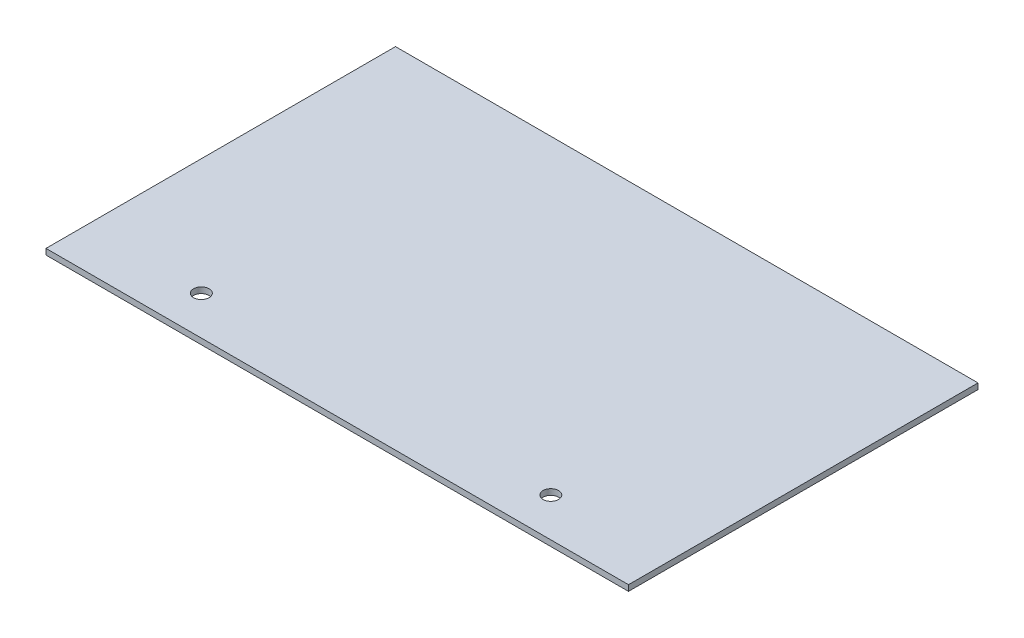
ISO-10303-21;
HEADER;
FILE_DESCRIPTION(('STEP AP214'),'2;1');
FILE_NAME('part.step','',(''),(''),'','','');
FILE_SCHEMA(('AUTOMOTIVE_DESIGN { 1 0 10303 214 1 1 1 1 }'));
ENDSEC;
DATA;
#1=APPLICATION_CONTEXT('core data for automotive mechanical design processes');
#2=APPLICATION_PROTOCOL_DEFINITION('international standard','automotive_design',2000,#1);
#3=PRODUCT_CONTEXT('',#1,'mechanical');
#4=PRODUCT('Part','Part','',(#3));
#5=PRODUCT_RELATED_PRODUCT_CATEGORY('part','',(#4));
#6=PRODUCT_DEFINITION_FORMATION('','',#4);
#7=PRODUCT_DEFINITION_CONTEXT('part definition',#1,'design');
#8=PRODUCT_DEFINITION('design','',#6,#7);
#9=PRODUCT_DEFINITION_SHAPE('','',#8);
#10=(LENGTH_UNIT() NAMED_UNIT(*) SI_UNIT(.MILLI.,.METRE.));
#11=(NAMED_UNIT(*) PLANE_ANGLE_UNIT() SI_UNIT($,.RADIAN.));
#12=(NAMED_UNIT(*) SI_UNIT($,.STERADIAN.) SOLID_ANGLE_UNIT());
#13=UNCERTAINTY_MEASURE_WITH_UNIT(LENGTH_MEASURE(1.E-05),#10,'distance_accuracy_value','');
#14=(GEOMETRIC_REPRESENTATION_CONTEXT(3) GLOBAL_UNCERTAINTY_ASSIGNED_CONTEXT((#13)) GLOBAL_UNIT_ASSIGNED_CONTEXT((#10,
#11,#12)) REPRESENTATION_CONTEXT('',''));
#15=CARTESIAN_POINT('',(0.,0.,0.));
#16=DIRECTION('',(0.,0.,1.));
#17=DIRECTION('',(1.,0.,0.));
#18=AXIS2_PLACEMENT_3D('',#15,#16,#17);
#19=CARTESIAN_POINT('',(0.,3.,0.));
#20=DIRECTION('',(1.,0.,0.));
#21=DIRECTION('',(0.,0.,-1.));
#22=AXIS2_PLACEMENT_3D('',#19,#20,#21);
#23=PLANE('',#22);
#24=DIRECTION('',(0.,0.,1.));
#25=VECTOR('',#24,1.);
#26=CARTESIAN_POINT('',(0.,0.,0.));
#27=LINE('',#26,#25);
#28=CARTESIAN_POINT('',(0.,0.,0.));
#29=VERTEX_POINT('',#28);
#30=CARTESIAN_POINT('',(0.,0.,180.));
#31=VERTEX_POINT('',#30);
#32=EDGE_CURVE('E99',#29,#31,#27,.T.);
#33=ORIENTED_EDGE('',*,*,#32,.T.);
#34=DIRECTION('',(0.,-1.,0.));
#35=VECTOR('',#34,1.);
#36=CARTESIAN_POINT('',(0.,3.,180.));
#37=LINE('',#36,#35);
#38=CARTESIAN_POINT('',(0.,3.,180.));
#39=VERTEX_POINT('',#38);
#40=EDGE_CURVE('E11',#39,#31,#37,.T.);
#41=ORIENTED_EDGE('',*,*,#40,.F.);
#42=DIRECTION('',(0.,0.,1.));
#43=VECTOR('',#42,1.);
#44=CARTESIAN_POINT('',(0.,3.,0.));
#45=LINE('',#44,#43);
#46=CARTESIAN_POINT('',(0.,3.,0.));
#47=VERTEX_POINT('',#46);
#48=EDGE_CURVE('E87',#47,#39,#45,.T.);
#49=ORIENTED_EDGE('',*,*,#48,.F.);
#50=DIRECTION('',(0.,-1.,0.));
#51=VECTOR('',#50,1.);
#52=CARTESIAN_POINT('',(0.,3.,0.));
#53=LINE('',#52,#51);
#54=EDGE_CURVE('E95',#47,#29,#53,.T.);
#55=ORIENTED_EDGE('',*,*,#54,.T.);
#56=EDGE_LOOP('',(#33,#41,#49,#55));
#57=FACE_BOUND('',#56,.T.);
#58=ADVANCED_FACE('F36',(#57),#23,.F.);
#59=CARTESIAN_POINT('',(0.,3.,180.));
#60=DIRECTION('',(0.,0.,-1.));
#61=DIRECTION('',(-1.,0.,0.));
#62=AXIS2_PLACEMENT_3D('',#59,#60,#61);
#63=PLANE('',#62);
#64=DIRECTION('',(1.,0.,0.));
#65=VECTOR('',#64,1.);
#66=CARTESIAN_POINT('',(0.,0.,180.));
#67=LINE('',#66,#65);
#68=CARTESIAN_POINT('',(300.,0.,180.));
#69=VERTEX_POINT('',#68);
#70=EDGE_CURVE('E91',#31,#69,#67,.T.);
#71=ORIENTED_EDGE('',*,*,#70,.T.);
#72=DIRECTION('',(0.,-1.,0.));
#73=VECTOR('',#72,1.);
#74=CARTESIAN_POINT('',(300.,3.,180.));
#75=LINE('',#74,#73);
#76=CARTESIAN_POINT('',(300.,3.,180.));
#77=VERTEX_POINT('',#76);
#78=EDGE_CURVE('E44',#77,#69,#75,.T.);
#79=ORIENTED_EDGE('',*,*,#78,.F.);
#80=DIRECTION('',(1.,0.,0.));
#81=VECTOR('',#80,1.);
#82=CARTESIAN_POINT('',(0.,3.,180.));
#83=LINE('',#82,#81);
#84=EDGE_CURVE('E82',#39,#77,#83,.T.);
#85=ORIENTED_EDGE('',*,*,#84,.F.);
#86=ORIENTED_EDGE('',*,*,#40,.T.);
#87=EDGE_LOOP('',(#71,#79,#85,#86));
#88=FACE_BOUND('',#87,.T.);
#89=ADVANCED_FACE('F90',(#88),#63,.F.);
#90=CARTESIAN_POINT('',(300.,3.,0.));
#91=DIRECTION('',(-1.,0.,0.));
#92=DIRECTION('',(0.,0.,1.));
#93=AXIS2_PLACEMENT_3D('',#90,#91,#92);
#94=PLANE('',#93);
#95=DIRECTION('',(0.,0.,-1.));
#96=VECTOR('',#95,1.);
#97=CARTESIAN_POINT('',(300.,0.,0.));
#98=LINE('',#97,#96);
#99=CARTESIAN_POINT('',(300.,0.,0.));
#100=VERTEX_POINT('',#99);
#101=EDGE_CURVE('E69',#69,#100,#98,.T.);
#102=ORIENTED_EDGE('',*,*,#101,.T.);
#103=DIRECTION('',(0.,-1.,0.));
#104=VECTOR('',#103,1.);
#105=CARTESIAN_POINT('',(300.,3.,0.));
#106=LINE('',#105,#104);
#107=CARTESIAN_POINT('',(300.,3.,0.));
#108=VERTEX_POINT('',#107);
#109=EDGE_CURVE('E92',#108,#100,#106,.T.);
#110=ORIENTED_EDGE('',*,*,#109,.F.);
#111=DIRECTION('',(0.,0.,-1.));
#112=VECTOR('',#111,1.);
#113=CARTESIAN_POINT('',(300.,3.,0.));
#114=LINE('',#113,#112);
#115=EDGE_CURVE('E85',#77,#108,#114,.T.);
#116=ORIENTED_EDGE('',*,*,#115,.F.);
#117=ORIENTED_EDGE('',*,*,#78,.T.);
#118=EDGE_LOOP('',(#102,#110,#116,#117));
#119=FACE_BOUND('',#118,.T.);
#120=ADVANCED_FACE('F93',(#119),#94,.F.);
#121=CARTESIAN_POINT('',(0.,3.,0.));
#122=DIRECTION('',(0.,0.,1.));
#123=DIRECTION('',(1.,0.,0.));
#124=AXIS2_PLACEMENT_3D('',#121,#122,#123);
#125=PLANE('',#124);
#126=DIRECTION('',(-1.,0.,0.));
#127=VECTOR('',#126,1.);
#128=CARTESIAN_POINT('',(0.,0.,0.));
#129=LINE('',#128,#127);
#130=EDGE_CURVE('E75',#100,#29,#129,.T.);
#131=ORIENTED_EDGE('',*,*,#130,.T.);
#132=ORIENTED_EDGE('',*,*,#54,.F.);
#133=DIRECTION('',(-1.,0.,0.));
#134=VECTOR('',#133,1.);
#135=CARTESIAN_POINT('',(0.,3.,0.));
#136=LINE('',#135,#134);
#137=EDGE_CURVE('E52',#108,#47,#136,.T.);
#138=ORIENTED_EDGE('',*,*,#137,.F.);
#139=ORIENTED_EDGE('',*,*,#109,.T.);
#140=EDGE_LOOP('',(#131,#132,#138,#139));
#141=FACE_BOUND('',#140,.T.);
#142=ADVANCED_FACE('F107',(#141),#125,.F.);
#143=CARTESIAN_POINT('',(0.,3.,0.));
#144=DIRECTION('',(0.,1.,0.));
#145=DIRECTION('',(0.,0.,1.));
#146=AXIS2_PLACEMENT_3D('',#143,#144,#145);
#147=PLANE('',#146);
#148=CARTESIAN_POINT('',(60.,3.,160.));
#149=DIRECTION('',(0.,1.,0.));
#150=DIRECTION('',(0.,0.,1.));
#151=AXIS2_PLACEMENT_3D('',#148,#149,#150);
#152=CIRCLE('',#151,4.00000000000001);
#153=CARTESIAN_POINT('',(60.,3.,164.));
#154=VERTEX_POINT('',#153);
#155=EDGE_CURVE('E119',#154,#154,#152,.T.);
#156=ORIENTED_EDGE('',*,*,#155,.F.);
#157=EDGE_LOOP('',(#156));
#158=FACE_BOUND('',#157,.T.);
#159=CARTESIAN_POINT('',(240.,3.,160.));
#160=DIRECTION('',(0.,1.,0.));
#161=DIRECTION('',(0.,0.,1.));
#162=AXIS2_PLACEMENT_3D('',#159,#160,#161);
#163=CIRCLE('',#162,3.99999999999999);
#164=CARTESIAN_POINT('',(240.,3.,164.));
#165=VERTEX_POINT('',#164);
#166=EDGE_CURVE('E113',#165,#165,#163,.T.);
#167=ORIENTED_EDGE('',*,*,#166,.F.);
#168=EDGE_LOOP('',(#167));
#169=FACE_BOUND('',#168,.T.);
#170=ORIENTED_EDGE('',*,*,#48,.T.);
#171=ORIENTED_EDGE('',*,*,#84,.T.);
#172=ORIENTED_EDGE('',*,*,#115,.T.);
#173=ORIENTED_EDGE('',*,*,#137,.T.);
#174=EDGE_LOOP('',(#170,#171,#172,#173));
#175=FACE_BOUND('',#174,.T.);
#176=ADVANCED_FACE('F83',(#158,#169,#175),#147,.T.);
#177=CARTESIAN_POINT('',(0.,0.,0.));
#178=DIRECTION('',(0.,1.,0.));
#179=DIRECTION('',(0.,0.,1.));
#180=AXIS2_PLACEMENT_3D('',#177,#178,#179);
#181=PLANE('',#180);
#182=CARTESIAN_POINT('',(60.,0.,160.));
#183=DIRECTION('',(0.,1.,0.));
#184=DIRECTION('',(0.,0.,1.));
#185=AXIS2_PLACEMENT_3D('',#182,#183,#184);
#186=CIRCLE('',#185,4.00000000000001);
#187=CARTESIAN_POINT('',(60.,0.,164.));
#188=VERTEX_POINT('',#187);
#189=EDGE_CURVE('E102',#188,#188,#186,.T.);
#190=ORIENTED_EDGE('',*,*,#189,.T.);
#191=EDGE_LOOP('',(#190));
#192=FACE_BOUND('',#191,.T.);
#193=CARTESIAN_POINT('',(240.,0.,160.));
#194=DIRECTION('',(0.,1.,0.));
#195=DIRECTION('',(0.,0.,1.));
#196=AXIS2_PLACEMENT_3D('',#193,#194,#195);
#197=CIRCLE('',#196,3.99999999999999);
#198=CARTESIAN_POINT('',(240.,0.,164.));
#199=VERTEX_POINT('',#198);
#200=EDGE_CURVE('E116',#199,#199,#197,.T.);
#201=ORIENTED_EDGE('',*,*,#200,.T.);
#202=EDGE_LOOP('',(#201));
#203=FACE_BOUND('',#202,.T.);
#204=ORIENTED_EDGE('',*,*,#32,.F.);
#205=ORIENTED_EDGE('',*,*,#130,.F.);
#206=ORIENTED_EDGE('',*,*,#101,.F.);
#207=ORIENTED_EDGE('',*,*,#70,.F.);
#208=EDGE_LOOP('',(#204,#205,#206,#207));
#209=FACE_BOUND('',#208,.T.);
#210=ADVANCED_FACE('F110',(#192,#203,#209),#181,.F.);
#211=CARTESIAN_POINT('',(240.,0.,160.));
#212=DIRECTION('',(0.,1.,0.));
#213=DIRECTION('',(0.,0.,1.));
#214=AXIS2_PLACEMENT_3D('',#211,#212,#213);
#215=CYLINDRICAL_SURFACE('',#214,3.99999999999999);
#216=ORIENTED_EDGE('',*,*,#200,.F.);
#217=EDGE_LOOP('',(#216));
#218=FACE_BOUND('',#217,.T.);
#219=ORIENTED_EDGE('',*,*,#166,.T.);
#220=EDGE_LOOP('',(#219));
#221=FACE_BOUND('',#220,.T.);
#222=ADVANCED_FACE('F130',(#218,#221),#215,.F.);
#223=CARTESIAN_POINT('',(60.,0.,160.));
#224=DIRECTION('',(0.,1.,0.));
#225=DIRECTION('',(0.,0.,1.));
#226=AXIS2_PLACEMENT_3D('',#223,#224,#225);
#227=CYLINDRICAL_SURFACE('',#226,4.00000000000001);
#228=ORIENTED_EDGE('',*,*,#189,.F.);
#229=EDGE_LOOP('',(#228));
#230=FACE_BOUND('',#229,.T.);
#231=ORIENTED_EDGE('',*,*,#155,.T.);
#232=EDGE_LOOP('',(#231));
#233=FACE_BOUND('',#232,.T.);
#234=ADVANCED_FACE('F127',(#230,#233),#227,.F.);
#235=CLOSED_SHELL('',(#58,#89,#120,#142,#176,#210,#222,#234));
#236=MANIFOLD_SOLID_BREP('B2',#235);
#237=ADVANCED_BREP_SHAPE_REPRESENTATION('',(#18,#236),#14);
#238=SHAPE_DEFINITION_REPRESENTATION(#9,#237);
ENDSEC;
END-ISO-10303-21;
